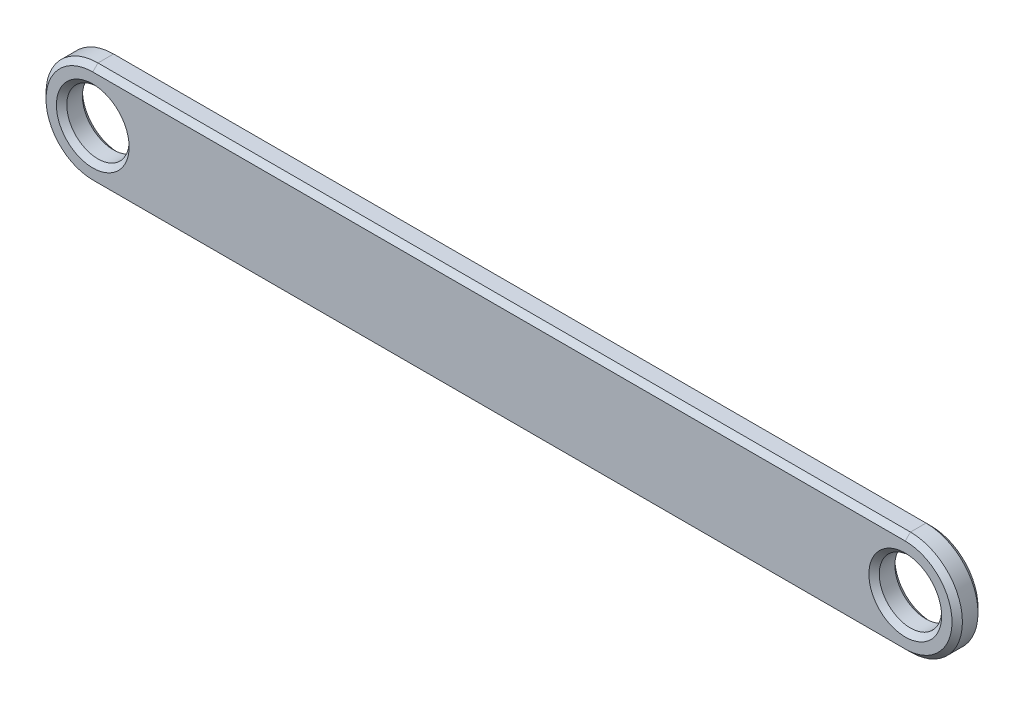
ISO-10303-21;
HEADER;
FILE_DESCRIPTION(('STEP AP214'),'2;1');
FILE_NAME('part.step','',(''),(''),'','','');
FILE_SCHEMA(('AUTOMOTIVE_DESIGN { 1 0 10303 214 1 1 1 1 }'));
ENDSEC;
DATA;
#1=APPLICATION_CONTEXT('core data for automotive mechanical design processes');
#2=APPLICATION_PROTOCOL_DEFINITION('international standard','automotive_design',2000,#1);
#3=PRODUCT_CONTEXT('',#1,'mechanical');
#4=PRODUCT('Part','Part','',(#3));
#5=PRODUCT_RELATED_PRODUCT_CATEGORY('part','',(#4));
#6=PRODUCT_DEFINITION_FORMATION('','',#4);
#7=PRODUCT_DEFINITION_CONTEXT('part definition',#1,'design');
#8=PRODUCT_DEFINITION('design','',#6,#7);
#9=PRODUCT_DEFINITION_SHAPE('','',#8);
#10=(LENGTH_UNIT() NAMED_UNIT(*) SI_UNIT(.MILLI.,.METRE.));
#11=(NAMED_UNIT(*) PLANE_ANGLE_UNIT() SI_UNIT($,.RADIAN.));
#12=(NAMED_UNIT(*) SI_UNIT($,.STERADIAN.) SOLID_ANGLE_UNIT());
#13=UNCERTAINTY_MEASURE_WITH_UNIT(LENGTH_MEASURE(1.E-05),#10,'distance_accuracy_value','');
#14=(GEOMETRIC_REPRESENTATION_CONTEXT(3) GLOBAL_UNCERTAINTY_ASSIGNED_CONTEXT((#13)) GLOBAL_UNIT_ASSIGNED_CONTEXT((#10,
#11,#12)) REPRESENTATION_CONTEXT('',''));
#15=CARTESIAN_POINT('',(0.,0.,0.));
#16=DIRECTION('',(0.,0.,1.));
#17=DIRECTION('',(1.,0.,0.));
#18=AXIS2_PLACEMENT_3D('',#15,#16,#17);
#19=CARTESIAN_POINT('',(-390.915,0.,25.));
#20=DIRECTION('',(0.,0.,1.));
#21=DIRECTION('',(1.,0.,0.));
#22=AXIS2_PLACEMENT_3D('',#19,#20,#21);
#23=PLANE('',#22);
#24=CARTESIAN_POINT('',(390.915,0.,25.));
#25=DIRECTION('',(0.,0.,1.));
#26=DIRECTION('',(1.,0.,0.));
#27=AXIS2_PLACEMENT_3D('',#24,#25,#26);
#28=CIRCLE('',#27,35.0000000000002);
#29=CARTESIAN_POINT('',(425.915,0.,25.));
#30=VERTEX_POINT('',#29);
#31=EDGE_CURVE('E11',#30,#30,#28,.F.);
#32=ORIENTED_EDGE('',*,*,#31,.T.);
#33=EDGE_LOOP('',(#32));
#34=FACE_BOUND('',#33,.T.);
#35=CARTESIAN_POINT('',(390.915,0.,25.));
#36=DIRECTION('',(0.,0.,1.));
#37=DIRECTION('',(1.,0.,0.));
#38=AXIS2_PLACEMENT_3D('',#35,#36,#37);
#39=CIRCLE('',#38,45.0000000000001);
#40=CARTESIAN_POINT('',(390.915,-45.,25.));
#41=VERTEX_POINT('',#40);
#42=CARTESIAN_POINT('',(390.915,45.0000000000001,25.));
#43=VERTEX_POINT('',#42);
#44=EDGE_CURVE('E52',#41,#43,#39,.T.);
#45=ORIENTED_EDGE('',*,*,#44,.T.);
#46=DIRECTION('',(-1.,0.,0.));
#47=VECTOR('',#46,1.);
#48=CARTESIAN_POINT('',(-390.915,45.0000000000001,25.));
#49=LINE('',#48,#47);
#50=CARTESIAN_POINT('',(-390.915,45.0000000000001,25.));
#51=VERTEX_POINT('',#50);
#52=EDGE_CURVE('E44',#43,#51,#49,.T.);
#53=ORIENTED_EDGE('',*,*,#52,.T.);
#54=CARTESIAN_POINT('',(-390.915,0.,25.));
#55=DIRECTION('',(0.,0.,1.));
#56=DIRECTION('',(1.,0.,0.));
#57=AXIS2_PLACEMENT_3D('',#54,#55,#56);
#58=CIRCLE('',#57,45.0000000000001);
#59=CARTESIAN_POINT('',(-390.915,-45.0000000000001,25.));
#60=VERTEX_POINT('',#59);
#61=EDGE_CURVE('E170',#51,#60,#58,.T.);
#62=ORIENTED_EDGE('',*,*,#61,.T.);
#63=DIRECTION('',(1.,0.,0.));
#64=VECTOR('',#63,1.);
#65=CARTESIAN_POINT('',(390.915,-45.,25.));
#66=LINE('',#65,#64);
#67=EDGE_CURVE('E57',#60,#41,#66,.T.);
#68=ORIENTED_EDGE('',*,*,#67,.T.);
#69=EDGE_LOOP('',(#45,#53,#62,#68));
#70=FACE_BOUND('',#69,.T.);
#71=CARTESIAN_POINT('',(-390.915,0.,25.));
#72=DIRECTION('',(0.,0.,1.));
#73=DIRECTION('',(1.,0.,0.));
#74=AXIS2_PLACEMENT_3D('',#71,#72,#73);
#75=CIRCLE('',#74,35.0000000000002);
#76=CARTESIAN_POINT('',(-355.915,0.,25.));
#77=VERTEX_POINT('',#76);
#78=EDGE_CURVE('E167',#77,#77,#75,.F.);
#79=ORIENTED_EDGE('',*,*,#78,.T.);
#80=EDGE_LOOP('',(#79));
#81=FACE_BOUND('',#80,.T.);
#82=ADVANCED_FACE('F35',(#34,#70,#81),#23,.T.);
#83=CARTESIAN_POINT('',(-390.915,0.,0.));
#84=DIRECTION('',(0.,0.,1.));
#85=DIRECTION('',(1.,0.,0.));
#86=AXIS2_PLACEMENT_3D('',#83,#84,#85);
#87=PLANE('',#86);
#88=CARTESIAN_POINT('',(390.915,0.,0.));
#89=DIRECTION('',(0.,0.,1.));
#90=DIRECTION('',(1.,0.,0.));
#91=AXIS2_PLACEMENT_3D('',#88,#89,#90);
#92=CIRCLE('',#91,35.0000000000002);
#93=CARTESIAN_POINT('',(425.915,0.,0.));
#94=VERTEX_POINT('',#93);
#95=EDGE_CURVE('E132',#94,#94,#92,.T.);
#96=ORIENTED_EDGE('',*,*,#95,.T.);
#97=EDGE_LOOP('',(#96));
#98=FACE_BOUND('',#97,.T.);
#99=CARTESIAN_POINT('',(-390.915,0.,0.));
#100=DIRECTION('',(0.,0.,1.));
#101=DIRECTION('',(1.,0.,0.));
#102=AXIS2_PLACEMENT_3D('',#99,#100,#101);
#103=CIRCLE('',#102,35.0000000000002);
#104=CARTESIAN_POINT('',(-355.915,0.,0.));
#105=VERTEX_POINT('',#104);
#106=EDGE_CURVE('E129',#105,#105,#103,.T.);
#107=ORIENTED_EDGE('',*,*,#106,.T.);
#108=EDGE_LOOP('',(#107));
#109=FACE_BOUND('',#108,.T.);
#110=CARTESIAN_POINT('',(390.915,0.,0.));
#111=DIRECTION('',(0.,0.,1.));
#112=DIRECTION('',(1.,0.,0.));
#113=AXIS2_PLACEMENT_3D('',#110,#111,#112);
#114=CIRCLE('',#113,44.9999999999999);
#115=CARTESIAN_POINT('',(390.915,45.,0.));
#116=VERTEX_POINT('',#115);
#117=CARTESIAN_POINT('',(390.915,-44.9999999999998,0.));
#118=VERTEX_POINT('',#117);
#119=EDGE_CURVE('E128',#116,#118,#114,.F.);
#120=ORIENTED_EDGE('',*,*,#119,.T.);
#121=DIRECTION('',(-1.,0.,0.));
#122=VECTOR('',#121,1.);
#123=CARTESIAN_POINT('',(-390.915,-44.9999999999999,0.));
#124=LINE('',#123,#122);
#125=CARTESIAN_POINT('',(-390.915,-44.9999999999999,0.));
#126=VERTEX_POINT('',#125);
#127=EDGE_CURVE('E107',#118,#126,#124,.T.);
#128=ORIENTED_EDGE('',*,*,#127,.T.);
#129=CARTESIAN_POINT('',(-390.915,0.,0.));
#130=DIRECTION('',(0.,0.,1.));
#131=DIRECTION('',(1.,0.,0.));
#132=AXIS2_PLACEMENT_3D('',#129,#130,#131);
#133=CIRCLE('',#132,44.9999999999999);
#134=CARTESIAN_POINT('',(-390.915,44.9999999999999,0.));
#135=VERTEX_POINT('',#134);
#136=EDGE_CURVE('E117',#126,#135,#133,.F.);
#137=ORIENTED_EDGE('',*,*,#136,.T.);
#138=DIRECTION('',(1.,0.,0.));
#139=VECTOR('',#138,1.);
#140=CARTESIAN_POINT('',(-390.915,44.9999999999999,0.));
#141=LINE('',#140,#139);
#142=EDGE_CURVE('E123',#135,#116,#141,.T.);
#143=ORIENTED_EDGE('',*,*,#142,.T.);
#144=EDGE_LOOP('',(#120,#128,#137,#143));
#145=FACE_BOUND('',#144,.T.);
#146=ADVANCED_FACE('F126',(#98,#109,#145),#87,.F.);
#147=CARTESIAN_POINT('',(-390.915,0.,25.));
#148=DIRECTION('',(0.,0.,-1.));
#149=DIRECTION('',(-1.,0.,0.));
#150=AXIS2_PLACEMENT_3D('',#147,#148,#149);
#151=CYLINDRICAL_SURFACE('',#150,50.);
#152=DIRECTION('',(0.,0.,-1.));
#153=VECTOR('',#152,1.);
#154=CARTESIAN_POINT('',(-390.915,50.,25.));
#155=LINE('',#154,#153);
#156=CARTESIAN_POINT('',(-390.915,50.,20.0000000000001));
#157=VERTEX_POINT('',#156);
#158=CARTESIAN_POINT('',(-390.915,50.,5.00000000000001));
#159=VERTEX_POINT('',#158);
#160=EDGE_CURVE('E179',#157,#159,#155,.T.);
#161=ORIENTED_EDGE('',*,*,#160,.T.);
#162=CARTESIAN_POINT('',(-390.915,0.,5.00000000000001));
#163=DIRECTION('',(0.,0.,1.));
#164=DIRECTION('',(1.,0.,0.));
#165=AXIS2_PLACEMENT_3D('',#162,#163,#164);
#166=CIRCLE('',#165,50.);
#167=CARTESIAN_POINT('',(-390.915,-50.,5.00000000000001));
#168=VERTEX_POINT('',#167);
#169=EDGE_CURVE('E165',#159,#168,#166,.T.);
#170=ORIENTED_EDGE('',*,*,#169,.T.);
#171=DIRECTION('',(0.,0.,-1.));
#172=VECTOR('',#171,1.);
#173=CARTESIAN_POINT('',(-390.915,-50.,25.));
#174=LINE('',#173,#172);
#175=CARTESIAN_POINT('',(-390.915,-50.,20.0000000000001));
#176=VERTEX_POINT('',#175);
#177=EDGE_CURVE('E124',#176,#168,#174,.T.);
#178=ORIENTED_EDGE('',*,*,#177,.F.);
#179=CARTESIAN_POINT('',(-390.915,0.,20.0000000000001));
#180=DIRECTION('',(0.,0.,1.));
#181=DIRECTION('',(1.,0.,0.));
#182=AXIS2_PLACEMENT_3D('',#179,#180,#181);
#183=CIRCLE('',#182,50.);
#184=EDGE_CURVE('E163',#176,#157,#183,.F.);
#185=ORIENTED_EDGE('',*,*,#184,.T.);
#186=EDGE_LOOP('',(#161,#170,#178,#185));
#187=FACE_BOUND('',#186,.T.);
#188=ADVANCED_FACE('F205',(#187),#151,.T.);
#189=CARTESIAN_POINT('',(390.915,-49.9999999999999,25.));
#190=DIRECTION('',(0.,1.,0.));
#191=DIRECTION('',(-1.,0.,0.));
#192=AXIS2_PLACEMENT_3D('',#189,#190,#191);
#193=PLANE('',#192);
#194=ORIENTED_EDGE('',*,*,#177,.T.);
#195=DIRECTION('',(1.,0.,0.));
#196=VECTOR('',#195,1.);
#197=CARTESIAN_POINT('',(390.915,-49.9999999999999,5.00000000000001));
#198=LINE('',#197,#196);
#199=CARTESIAN_POINT('',(390.915,-49.9999999999999,5.00000000000001));
#200=VERTEX_POINT('',#199);
#201=EDGE_CURVE('E110',#168,#200,#198,.T.);
#202=ORIENTED_EDGE('',*,*,#201,.T.);
#203=DIRECTION('',(0.,0.,-1.));
#204=VECTOR('',#203,1.);
#205=CARTESIAN_POINT('',(390.915,-49.9999999999999,25.));
#206=LINE('',#205,#204);
#207=CARTESIAN_POINT('',(390.915,-49.9999999999999,20.0000000000001));
#208=VERTEX_POINT('',#207);
#209=EDGE_CURVE('E202',#208,#200,#206,.T.);
#210=ORIENTED_EDGE('',*,*,#209,.F.);
#211=DIRECTION('',(-1.,0.,0.));
#212=VECTOR('',#211,1.);
#213=CARTESIAN_POINT('',(-390.915,-50.,20.0000000000001));
#214=LINE('',#213,#212);
#215=EDGE_CURVE('E151',#208,#176,#214,.T.);
#216=ORIENTED_EDGE('',*,*,#215,.T.);
#217=EDGE_LOOP('',(#194,#202,#210,#216));
#218=FACE_BOUND('',#217,.T.);
#219=ADVANCED_FACE('F200',(#218),#193,.F.);
#220=CARTESIAN_POINT('',(390.915,0.,25.));
#221=DIRECTION('',(0.,0.,-1.));
#222=DIRECTION('',(-1.,0.,0.));
#223=AXIS2_PLACEMENT_3D('',#220,#221,#222);
#224=CYLINDRICAL_SURFACE('',#223,50.);
#225=ORIENTED_EDGE('',*,*,#209,.T.);
#226=CARTESIAN_POINT('',(390.915,0.,5.00000000000001));
#227=DIRECTION('',(0.,0.,1.));
#228=DIRECTION('',(1.,0.,0.));
#229=AXIS2_PLACEMENT_3D('',#226,#227,#228);
#230=CIRCLE('',#229,50.);
#231=CARTESIAN_POINT('',(390.915,50.0000000000001,5.00000000000001));
#232=VERTEX_POINT('',#231);
#233=EDGE_CURVE('E156',#200,#232,#230,.T.);
#234=ORIENTED_EDGE('',*,*,#233,.T.);
#235=DIRECTION('',(0.,0.,-1.));
#236=VECTOR('',#235,1.);
#237=CARTESIAN_POINT('',(390.915,50.0000000000001,25.));
#238=LINE('',#237,#236);
#239=CARTESIAN_POINT('',(390.915,50.0000000000001,20.0000000000001));
#240=VERTEX_POINT('',#239);
#241=EDGE_CURVE('E208',#240,#232,#238,.T.);
#242=ORIENTED_EDGE('',*,*,#241,.F.);
#243=CARTESIAN_POINT('',(390.915,0.,20.0000000000001));
#244=DIRECTION('',(0.,0.,1.));
#245=DIRECTION('',(1.,0.,0.));
#246=AXIS2_PLACEMENT_3D('',#243,#244,#245);
#247=CIRCLE('',#246,50.);
#248=EDGE_CURVE('E154',#240,#208,#247,.F.);
#249=ORIENTED_EDGE('',*,*,#248,.T.);
#250=EDGE_LOOP('',(#225,#234,#242,#249));
#251=FACE_BOUND('',#250,.T.);
#252=ADVANCED_FACE('F221',(#251),#224,.T.);
#253=CARTESIAN_POINT('',(390.915,50.0000000000001,25.));
#254=DIRECTION('',(0.,-1.,0.));
#255=DIRECTION('',(1.,0.,0.));
#256=AXIS2_PLACEMENT_3D('',#253,#254,#255);
#257=PLANE('',#256);
#258=ORIENTED_EDGE('',*,*,#241,.T.);
#259=DIRECTION('',(-1.,0.,0.));
#260=VECTOR('',#259,1.);
#261=CARTESIAN_POINT('',(390.915,50.0000000000001,5.00000000000001));
#262=LINE('',#261,#260);
#263=EDGE_CURVE('E161',#232,#159,#262,.T.);
#264=ORIENTED_EDGE('',*,*,#263,.T.);
#265=ORIENTED_EDGE('',*,*,#160,.F.);
#266=DIRECTION('',(1.,0.,0.));
#267=VECTOR('',#266,1.);
#268=CARTESIAN_POINT('',(390.915,50.0000000000001,20.0000000000001));
#269=LINE('',#268,#267);
#270=EDGE_CURVE('E158',#157,#240,#269,.T.);
#271=ORIENTED_EDGE('',*,*,#270,.T.);
#272=EDGE_LOOP('',(#258,#264,#265,#271));
#273=FACE_BOUND('',#272,.T.);
#274=ADVANCED_FACE('F225',(#273),#257,.F.);
#275=CARTESIAN_POINT('',(-390.915,0.,25.));
#276=DIRECTION('',(0.,0.,-1.));
#277=DIRECTION('',(-1.,0.,0.));
#278=AXIS2_PLACEMENT_3D('',#275,#276,#277);
#279=CYLINDRICAL_SURFACE('',#278,30.);
#280=CARTESIAN_POINT('',(-390.915,0.,4.99999999999997));
#281=DIRECTION('',(0.,0.,1.));
#282=DIRECTION('',(1.,0.,0.));
#283=AXIS2_PLACEMENT_3D('',#280,#281,#282);
#284=CIRCLE('',#283,30.);
#285=CARTESIAN_POINT('',(-360.915,0.,4.99999999999997));
#286=VERTEX_POINT('',#285);
#287=EDGE_CURVE('E148',#286,#286,#284,.F.);
#288=ORIENTED_EDGE('',*,*,#287,.T.);
#289=EDGE_LOOP('',(#288));
#290=FACE_BOUND('',#289,.T.);
#291=CARTESIAN_POINT('',(-390.915,0.,20.));
#292=DIRECTION('',(0.,0.,1.));
#293=DIRECTION('',(1.,0.,0.));
#294=AXIS2_PLACEMENT_3D('',#291,#292,#293);
#295=CIRCLE('',#294,30.);
#296=CARTESIAN_POINT('',(-360.915,0.,20.));
#297=VERTEX_POINT('',#296);
#298=EDGE_CURVE('E145',#297,#297,#295,.T.);
#299=ORIENTED_EDGE('',*,*,#298,.T.);
#300=EDGE_LOOP('',(#299));
#301=FACE_BOUND('',#300,.T.);
#302=ADVANCED_FACE('F241',(#290,#301),#279,.F.);
#303=CARTESIAN_POINT('',(390.915,0.,25.));
#304=DIRECTION('',(0.,0.,-1.));
#305=DIRECTION('',(-1.,0.,0.));
#306=AXIS2_PLACEMENT_3D('',#303,#304,#305);
#307=CYLINDRICAL_SURFACE('',#306,30.);
#308=CARTESIAN_POINT('',(390.915,0.,4.99999999999997));
#309=DIRECTION('',(0.,0.,1.));
#310=DIRECTION('',(1.,0.,0.));
#311=AXIS2_PLACEMENT_3D('',#308,#309,#310);
#312=CIRCLE('',#311,30.);
#313=CARTESIAN_POINT('',(420.915,0.,4.99999999999997));
#314=VERTEX_POINT('',#313);
#315=EDGE_CURVE('E142',#314,#314,#312,.F.);
#316=ORIENTED_EDGE('',*,*,#315,.T.);
#317=EDGE_LOOP('',(#316));
#318=FACE_BOUND('',#317,.T.);
#319=CARTESIAN_POINT('',(390.915,0.,20.));
#320=DIRECTION('',(0.,0.,1.));
#321=DIRECTION('',(1.,0.,0.));
#322=AXIS2_PLACEMENT_3D('',#319,#320,#321);
#323=CIRCLE('',#322,30.);
#324=CARTESIAN_POINT('',(420.915,0.,20.));
#325=VERTEX_POINT('',#324);
#326=EDGE_CURVE('E139',#325,#325,#323,.T.);
#327=ORIENTED_EDGE('',*,*,#326,.T.);
#328=EDGE_LOOP('',(#327));
#329=FACE_BOUND('',#328,.T.);
#330=ADVANCED_FACE('F243',(#318,#329),#307,.F.);
#331=CARTESIAN_POINT('',(390.915,0.,0.));
#332=DIRECTION('',(0.,0.,-1.));
#333=DIRECTION('',(-1.,0.,0.));
#334=AXIS2_PLACEMENT_3D('',#331,#332,#333);
#335=CONICAL_SURFACE('',#334,35.0000000000002,0.785398163397466);
#336=ORIENTED_EDGE('',*,*,#315,.F.);
#337=EDGE_LOOP('',(#336));
#338=FACE_BOUND('',#337,.T.);
#339=ORIENTED_EDGE('',*,*,#95,.F.);
#340=EDGE_LOOP('',(#339));
#341=FACE_BOUND('',#340,.T.);
#342=ADVANCED_FACE('F250',(#338,#341),#335,.F.);
#343=CARTESIAN_POINT('',(-390.915,0.,0.));
#344=DIRECTION('',(0.,0.,-1.));
#345=DIRECTION('',(-1.,0.,0.));
#346=AXIS2_PLACEMENT_3D('',#343,#344,#345);
#347=CONICAL_SURFACE('',#346,35.0000000000002,0.785398163397466);
#348=ORIENTED_EDGE('',*,*,#287,.F.);
#349=EDGE_LOOP('',(#348));
#350=FACE_BOUND('',#349,.T.);
#351=ORIENTED_EDGE('',*,*,#106,.F.);
#352=EDGE_LOOP('',(#351));
#353=FACE_BOUND('',#352,.T.);
#354=ADVANCED_FACE('F266',(#350,#353),#347,.F.);
#355=CARTESIAN_POINT('',(390.915,50.0000000000001,5.00000000000001));
#356=DIRECTION('',(0.,-0.707106781186544,0.707106781186551));
#357=DIRECTION('',(-1.,0.,0.));
#358=AXIS2_PLACEMENT_3D('',#355,#356,#357);
#359=PLANE('',#358);
#360=DIRECTION('',(0.,0.707106781186551,0.707106781186544));
#361=VECTOR('',#360,1.);
#362=CARTESIAN_POINT('',(390.915,45.,0.));
#363=LINE('',#362,#361);
#364=EDGE_CURVE('E113',#116,#232,#363,.T.);
#365=ORIENTED_EDGE('',*,*,#364,.F.);
#366=ORIENTED_EDGE('',*,*,#142,.F.);
#367=DIRECTION('',(0.,-0.707106781186551,-0.707106781186544));
#368=VECTOR('',#367,1.);
#369=CARTESIAN_POINT('',(-390.915,50.,5.00000000000001));
#370=LINE('',#369,#368);
#371=EDGE_CURVE('E120',#159,#135,#370,.T.);
#372=ORIENTED_EDGE('',*,*,#371,.F.);
#373=ORIENTED_EDGE('',*,*,#263,.F.);
#374=EDGE_LOOP('',(#365,#366,#372,#373));
#375=FACE_BOUND('',#374,.T.);
#376=ADVANCED_FACE('F214',(#375),#359,.F.);
#377=CARTESIAN_POINT('',(-390.915,0.,5.00000000000001));
#378=DIRECTION('',(0.,0.,1.));
#379=DIRECTION('',(1.,0.,0.));
#380=AXIS2_PLACEMENT_3D('',#377,#378,#379);
#381=CONICAL_SURFACE('',#380,50.,0.785398163397453);
#382=ORIENTED_EDGE('',*,*,#371,.T.);
#383=ORIENTED_EDGE('',*,*,#136,.F.);
#384=DIRECTION('',(0.,0.707106781186551,-0.707106781186544));
#385=VECTOR('',#384,1.);
#386=CARTESIAN_POINT('',(-390.915,-50.,5.00000000000001));
#387=LINE('',#386,#385);
#388=EDGE_CURVE('E103',#168,#126,#387,.T.);
#389=ORIENTED_EDGE('',*,*,#388,.F.);
#390=ORIENTED_EDGE('',*,*,#169,.F.);
#391=EDGE_LOOP('',(#382,#383,#389,#390));
#392=FACE_BOUND('',#391,.T.);
#393=ADVANCED_FACE('F118',(#392),#381,.T.);
#394=CARTESIAN_POINT('',(390.915,0.,5.00000000000001));
#395=DIRECTION('',(0.,0.,1.));
#396=DIRECTION('',(1.,0.,0.));
#397=AXIS2_PLACEMENT_3D('',#394,#395,#396);
#398=CONICAL_SURFACE('',#397,50.,0.785398163397453);
#399=ORIENTED_EDGE('',*,*,#364,.T.);
#400=ORIENTED_EDGE('',*,*,#233,.F.);
#401=DIRECTION('',(0.,-0.707106781186551,0.707106781186544));
#402=VECTOR('',#401,1.);
#403=CARTESIAN_POINT('',(390.915,-44.9999999999998,0.));
#404=LINE('',#403,#402);
#405=EDGE_CURVE('E114',#118,#200,#404,.T.);
#406=ORIENTED_EDGE('',*,*,#405,.F.);
#407=ORIENTED_EDGE('',*,*,#119,.F.);
#408=EDGE_LOOP('',(#399,#400,#406,#407));
#409=FACE_BOUND('',#408,.T.);
#410=ADVANCED_FACE('F217',(#409),#398,.T.);
#411=CARTESIAN_POINT('',(390.915,-49.9999999999999,5.00000000000001));
#412=DIRECTION('',(0.,0.707106781186544,0.707106781186551));
#413=DIRECTION('',(1.,0.,0.));
#414=AXIS2_PLACEMENT_3D('',#411,#412,#413);
#415=PLANE('',#414);
#416=ORIENTED_EDGE('',*,*,#388,.T.);
#417=ORIENTED_EDGE('',*,*,#127,.F.);
#418=ORIENTED_EDGE('',*,*,#405,.T.);
#419=ORIENTED_EDGE('',*,*,#201,.F.);
#420=EDGE_LOOP('',(#416,#417,#418,#419));
#421=FACE_BOUND('',#420,.T.);
#422=ADVANCED_FACE('F105',(#421),#415,.F.);
#423=CARTESIAN_POINT('',(390.915,0.,20.));
#424=DIRECTION('',(0.,0.,1.));
#425=DIRECTION('',(1.,0.,0.));
#426=AXIS2_PLACEMENT_3D('',#423,#424,#425);
#427=CONICAL_SURFACE('',#426,30.,0.785398163397466);
#428=ORIENTED_EDGE('',*,*,#31,.F.);
#429=EDGE_LOOP('',(#428));
#430=FACE_BOUND('',#429,.T.);
#431=ORIENTED_EDGE('',*,*,#326,.F.);
#432=EDGE_LOOP('',(#431));
#433=FACE_BOUND('',#432,.T.);
#434=ADVANCED_FACE('F273',(#430,#433),#427,.F.);
#435=CARTESIAN_POINT('',(-390.915,-45.0000000000001,25.));
#436=DIRECTION('',(0.,-0.707106781186544,0.707106781186551));
#437=DIRECTION('',(-1.,0.,0.));
#438=AXIS2_PLACEMENT_3D('',#435,#436,#437);
#439=PLANE('',#438);
#440=DIRECTION('',(0.,0.707106781186551,0.707106781186544));
#441=VECTOR('',#440,1.);
#442=CARTESIAN_POINT('',(-390.915,-50.,20.0000000000001));
#443=LINE('',#442,#441);
#444=EDGE_CURVE('E183',#176,#60,#443,.T.);
#445=ORIENTED_EDGE('',*,*,#444,.F.);
#446=ORIENTED_EDGE('',*,*,#215,.F.);
#447=DIRECTION('',(0.,-0.707106781186551,-0.707106781186544));
#448=VECTOR('',#447,1.);
#449=CARTESIAN_POINT('',(390.915,-45.,25.));
#450=LINE('',#449,#448);
#451=EDGE_CURVE('E39',#41,#208,#450,.T.);
#452=ORIENTED_EDGE('',*,*,#451,.F.);
#453=ORIENTED_EDGE('',*,*,#67,.F.);
#454=EDGE_LOOP('',(#445,#446,#452,#453));
#455=FACE_BOUND('',#454,.T.);
#456=ADVANCED_FACE('F195',(#455),#439,.T.);
#457=CARTESIAN_POINT('',(390.915,0.,25.));
#458=DIRECTION('',(0.,0.,-1.));
#459=DIRECTION('',(-1.,0.,0.));
#460=AXIS2_PLACEMENT_3D('',#457,#458,#459);
#461=CONICAL_SURFACE('',#460,45.0000000000001,0.785398163397453);
#462=ORIENTED_EDGE('',*,*,#451,.T.);
#463=ORIENTED_EDGE('',*,*,#248,.F.);
#464=DIRECTION('',(0.,0.707106781186551,-0.707106781186544));
#465=VECTOR('',#464,1.);
#466=CARTESIAN_POINT('',(390.915,45.0000000000001,25.));
#467=LINE('',#466,#465);
#468=EDGE_CURVE('E182',#43,#240,#467,.T.);
#469=ORIENTED_EDGE('',*,*,#468,.F.);
#470=ORIENTED_EDGE('',*,*,#44,.F.);
#471=EDGE_LOOP('',(#462,#463,#469,#470));
#472=FACE_BOUND('',#471,.T.);
#473=ADVANCED_FACE('F192',(#472),#461,.T.);
#474=CARTESIAN_POINT('',(-390.915,0.,25.));
#475=DIRECTION('',(0.,0.,-1.));
#476=DIRECTION('',(-1.,0.,0.));
#477=AXIS2_PLACEMENT_3D('',#474,#475,#476);
#478=CONICAL_SURFACE('',#477,45.0000000000001,0.785398163397453);
#479=ORIENTED_EDGE('',*,*,#444,.T.);
#480=ORIENTED_EDGE('',*,*,#61,.F.);
#481=DIRECTION('',(0.,-0.707106781186551,0.707106781186544));
#482=VECTOR('',#481,1.);
#483=CARTESIAN_POINT('',(-390.915,50.,20.0000000000001));
#484=LINE('',#483,#482);
#485=EDGE_CURVE('E180',#157,#51,#484,.T.);
#486=ORIENTED_EDGE('',*,*,#485,.F.);
#487=ORIENTED_EDGE('',*,*,#184,.F.);
#488=EDGE_LOOP('',(#479,#480,#486,#487));
#489=FACE_BOUND('',#488,.T.);
#490=ADVANCED_FACE('F230',(#489),#478,.T.);
#491=CARTESIAN_POINT('',(-390.915,45.0000000000001,25.));
#492=DIRECTION('',(0.,0.707106781186544,0.707106781186551));
#493=DIRECTION('',(1.,0.,0.));
#494=AXIS2_PLACEMENT_3D('',#491,#492,#493);
#495=PLANE('',#494);
#496=ORIENTED_EDGE('',*,*,#468,.T.);
#497=ORIENTED_EDGE('',*,*,#270,.F.);
#498=ORIENTED_EDGE('',*,*,#485,.T.);
#499=ORIENTED_EDGE('',*,*,#52,.F.);
#500=EDGE_LOOP('',(#496,#497,#498,#499));
#501=FACE_BOUND('',#500,.T.);
#502=ADVANCED_FACE('F228',(#501),#495,.T.);
#503=CARTESIAN_POINT('',(-390.915,0.,20.));
#504=DIRECTION('',(0.,0.,1.));
#505=DIRECTION('',(1.,0.,0.));
#506=AXIS2_PLACEMENT_3D('',#503,#504,#505);
#507=CONICAL_SURFACE('',#506,30.,0.785398163397466);
#508=ORIENTED_EDGE('',*,*,#78,.F.);
#509=EDGE_LOOP('',(#508));
#510=FACE_BOUND('',#509,.T.);
#511=ORIENTED_EDGE('',*,*,#298,.F.);
#512=EDGE_LOOP('',(#511));
#513=FACE_BOUND('',#512,.T.);
#514=ADVANCED_FACE('F37',(#510,#513),#507,.F.);
#515=CLOSED_SHELL('',(#82,#146,#188,#219,#252,#274,#302,#330,#342,#354,#376,#393,#410,#422,#434,
#456,#473,#490,#502,#514));
#516=MANIFOLD_SOLID_BREP('B2',#515);
#517=ADVANCED_BREP_SHAPE_REPRESENTATION('',(#18,#516),#14);
#518=SHAPE_DEFINITION_REPRESENTATION(#9,#517);
ENDSEC;
END-ISO-10303-21;
